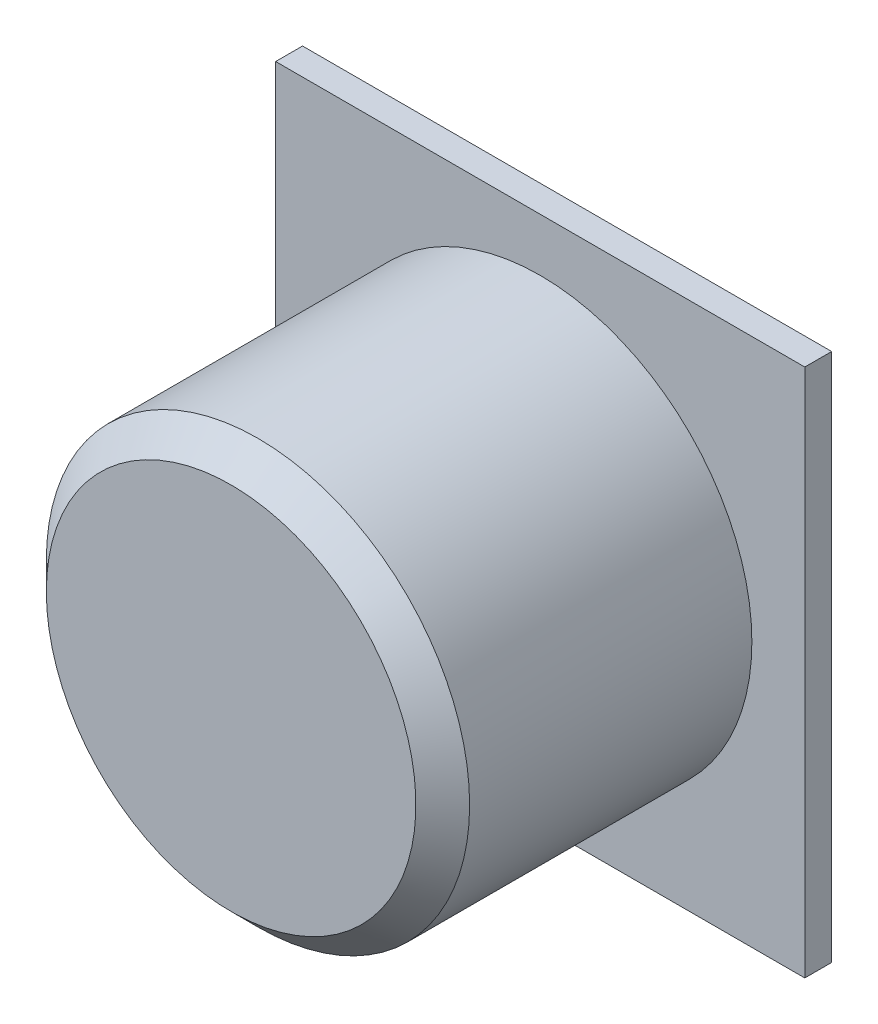
ISO-10303-21;
HEADER;
FILE_DESCRIPTION(('STEP AP214'),'2;1');
FILE_NAME('part.step','',(''),(''),'','','');
FILE_SCHEMA(('AUTOMOTIVE_DESIGN { 1 0 10303 214 1 1 1 1 }'));
ENDSEC;
DATA;
#1=APPLICATION_CONTEXT('core data for automotive mechanical design processes');
#2=APPLICATION_PROTOCOL_DEFINITION('international standard','automotive_design',2000,#1);
#3=PRODUCT_CONTEXT('',#1,'mechanical');
#4=PRODUCT('Part','Part','',(#3));
#5=PRODUCT_RELATED_PRODUCT_CATEGORY('part','',(#4));
#6=PRODUCT_DEFINITION_FORMATION('','',#4);
#7=PRODUCT_DEFINITION_CONTEXT('part definition',#1,'design');
#8=PRODUCT_DEFINITION('design','',#6,#7);
#9=PRODUCT_DEFINITION_SHAPE('','',#8);
#10=(LENGTH_UNIT() NAMED_UNIT(*) SI_UNIT(.MILLI.,.METRE.));
#11=(NAMED_UNIT(*) PLANE_ANGLE_UNIT() SI_UNIT($,.RADIAN.));
#12=(NAMED_UNIT(*) SI_UNIT($,.STERADIAN.) SOLID_ANGLE_UNIT());
#13=UNCERTAINTY_MEASURE_WITH_UNIT(LENGTH_MEASURE(1.E-05),#10,'distance_accuracy_value','');
#14=(GEOMETRIC_REPRESENTATION_CONTEXT(3) GLOBAL_UNCERTAINTY_ASSIGNED_CONTEXT((#13)) GLOBAL_UNIT_ASSIGNED_CONTEXT((#10,
#11,#12)) REPRESENTATION_CONTEXT('',''));
#15=CARTESIAN_POINT('',(0.,0.,0.));
#16=DIRECTION('',(0.,0.,1.));
#17=DIRECTION('',(1.,0.,0.));
#18=AXIS2_PLACEMENT_3D('',#15,#16,#17);
#19=CARTESIAN_POINT('',(-50.,-50.,5.08));
#20=DIRECTION('',(1.,0.,0.));
#21=DIRECTION('',(0.,0.,-1.));
#22=AXIS2_PLACEMENT_3D('',#19,#20,#21);
#23=PLANE('',#22);
#24=DIRECTION('',(0.,-1.,0.));
#25=VECTOR('',#24,1.);
#26=CARTESIAN_POINT('',(-50.,-50.,0.));
#27=LINE('',#26,#25);
#28=CARTESIAN_POINT('',(-50.,50.,0.));
#29=VERTEX_POINT('',#28);
#30=CARTESIAN_POINT('',(-50.,-50.,0.));
#31=VERTEX_POINT('',#30);
#32=EDGE_CURVE('E112',#29,#31,#27,.T.);
#33=ORIENTED_EDGE('',*,*,#32,.T.);
#34=DIRECTION('',(0.,0.,-1.));
#35=VECTOR('',#34,1.);
#36=CARTESIAN_POINT('',(-50.,-50.,5.08));
#37=LINE('',#36,#35);
#38=CARTESIAN_POINT('',(-50.,-50.,5.08));
#39=VERTEX_POINT('',#38);
#40=EDGE_CURVE('E101',#39,#31,#37,.T.);
#41=ORIENTED_EDGE('',*,*,#40,.F.);
#42=DIRECTION('',(0.,-1.,0.));
#43=VECTOR('',#42,1.);
#44=CARTESIAN_POINT('',(-50.,-50.,5.08));
#45=LINE('',#44,#43);
#46=CARTESIAN_POINT('',(-50.,50.,5.08));
#47=VERTEX_POINT('',#46);
#48=EDGE_CURVE('E93',#47,#39,#45,.T.);
#49=ORIENTED_EDGE('',*,*,#48,.F.);
#50=DIRECTION('',(0.,0.,-1.));
#51=VECTOR('',#50,1.);
#52=CARTESIAN_POINT('',(-50.,50.,5.08));
#53=LINE('',#52,#51);
#54=EDGE_CURVE('E108',#47,#29,#53,.T.);
#55=ORIENTED_EDGE('',*,*,#54,.T.);
#56=EDGE_LOOP('',(#33,#41,#49,#55));
#57=FACE_BOUND('',#56,.T.);
#58=ADVANCED_FACE('F39',(#57),#23,.F.);
#59=CARTESIAN_POINT('',(50.,-50.,5.08));
#60=DIRECTION('',(0.,1.,0.));
#61=DIRECTION('',(-1.,0.,0.));
#62=AXIS2_PLACEMENT_3D('',#59,#60,#61);
#63=PLANE('',#62);
#64=DIRECTION('',(1.,0.,0.));
#65=VECTOR('',#64,1.);
#66=CARTESIAN_POINT('',(50.,-50.,0.));
#67=LINE('',#66,#65);
#68=CARTESIAN_POINT('',(50.,-50.,0.));
#69=VERTEX_POINT('',#68);
#70=EDGE_CURVE('E99',#31,#69,#67,.T.);
#71=ORIENTED_EDGE('',*,*,#70,.T.);
#72=DIRECTION('',(0.,0.,-1.));
#73=VECTOR('',#72,1.);
#74=CARTESIAN_POINT('',(50.,-50.,5.08));
#75=LINE('',#74,#73);
#76=CARTESIAN_POINT('',(50.,-50.,5.08));
#77=VERTEX_POINT('',#76);
#78=EDGE_CURVE('E97',#77,#69,#75,.T.);
#79=ORIENTED_EDGE('',*,*,#78,.F.);
#80=DIRECTION('',(1.,0.,0.));
#81=VECTOR('',#80,1.);
#82=CARTESIAN_POINT('',(50.,-50.,5.08));
#83=LINE('',#82,#81);
#84=EDGE_CURVE('E88',#39,#77,#83,.T.);
#85=ORIENTED_EDGE('',*,*,#84,.F.);
#86=ORIENTED_EDGE('',*,*,#40,.T.);
#87=EDGE_LOOP('',(#71,#79,#85,#86));
#88=FACE_BOUND('',#87,.T.);
#89=ADVANCED_FACE('F98',(#88),#63,.F.);
#90=CARTESIAN_POINT('',(50.,-50.,5.08));
#91=DIRECTION('',(-1.,0.,0.));
#92=DIRECTION('',(0.,-1.,0.));
#93=AXIS2_PLACEMENT_3D('',#90,#91,#92);
#94=PLANE('',#93);
#95=DIRECTION('',(0.,1.,0.));
#96=VECTOR('',#95,1.);
#97=CARTESIAN_POINT('',(50.,-50.,0.));
#98=LINE('',#97,#96);
#99=CARTESIAN_POINT('',(50.,50.,0.));
#100=VERTEX_POINT('',#99);
#101=EDGE_CURVE('E74',#69,#100,#98,.T.);
#102=ORIENTED_EDGE('',*,*,#101,.T.);
#103=DIRECTION('',(0.,0.,-1.));
#104=VECTOR('',#103,1.);
#105=CARTESIAN_POINT('',(50.,50.,5.08));
#106=LINE('',#105,#104);
#107=CARTESIAN_POINT('',(50.,50.,5.08));
#108=VERTEX_POINT('',#107);
#109=EDGE_CURVE('E102',#108,#100,#106,.T.);
#110=ORIENTED_EDGE('',*,*,#109,.F.);
#111=DIRECTION('',(0.,1.,0.));
#112=VECTOR('',#111,1.);
#113=CARTESIAN_POINT('',(50.,-50.,5.08));
#114=LINE('',#113,#112);
#115=EDGE_CURVE('E91',#77,#108,#114,.T.);
#116=ORIENTED_EDGE('',*,*,#115,.F.);
#117=ORIENTED_EDGE('',*,*,#78,.T.);
#118=EDGE_LOOP('',(#102,#110,#116,#117));
#119=FACE_BOUND('',#118,.T.);
#120=ADVANCED_FACE('F104',(#119),#94,.F.);
#121=CARTESIAN_POINT('',(50.,50.,5.08));
#122=DIRECTION('',(0.,-1.,0.));
#123=DIRECTION('',(1.,0.,0.));
#124=AXIS2_PLACEMENT_3D('',#121,#122,#123);
#125=PLANE('',#124);
#126=DIRECTION('',(-1.,0.,0.));
#127=VECTOR('',#126,1.);
#128=CARTESIAN_POINT('',(50.,50.,0.));
#129=LINE('',#128,#127);
#130=EDGE_CURVE('E80',#100,#29,#129,.T.);
#131=ORIENTED_EDGE('',*,*,#130,.T.);
#132=ORIENTED_EDGE('',*,*,#54,.F.);
#133=DIRECTION('',(-1.,0.,0.));
#134=VECTOR('',#133,1.);
#135=CARTESIAN_POINT('',(50.,50.,5.08));
#136=LINE('',#135,#134);
#137=EDGE_CURVE('E57',#108,#47,#136,.T.);
#138=ORIENTED_EDGE('',*,*,#137,.F.);
#139=ORIENTED_EDGE('',*,*,#109,.T.);
#140=EDGE_LOOP('',(#131,#132,#138,#139));
#141=FACE_BOUND('',#140,.T.);
#142=ADVANCED_FACE('F151',(#141),#125,.F.);
#143=CARTESIAN_POINT('',(0.,0.,5.08));
#144=DIRECTION('',(0.,0.,1.));
#145=DIRECTION('',(1.,0.,0.));
#146=AXIS2_PLACEMENT_3D('',#143,#144,#145);
#147=PLANE('',#146);
#148=CARTESIAN_POINT('',(0.,0.,5.08));
#149=DIRECTION('',(0.,0.,1.));
#150=DIRECTION('',(1.,0.,0.));
#151=AXIS2_PLACEMENT_3D('',#148,#149,#150);
#152=CIRCLE('',#151,40.);
#153=CARTESIAN_POINT('',(40.,0.,5.08));
#154=VERTEX_POINT('',#153);
#155=EDGE_CURVE('E116',#154,#154,#152,.F.);
#156=ORIENTED_EDGE('',*,*,#155,.T.);
#157=EDGE_LOOP('',(#156));
#158=FACE_BOUND('',#157,.T.);
#159=ORIENTED_EDGE('',*,*,#48,.T.);
#160=ORIENTED_EDGE('',*,*,#84,.T.);
#161=ORIENTED_EDGE('',*,*,#115,.T.);
#162=ORIENTED_EDGE('',*,*,#137,.T.);
#163=EDGE_LOOP('',(#159,#160,#161,#162));
#164=FACE_BOUND('',#163,.T.);
#165=ADVANCED_FACE('F89',(#158,#164),#147,.T.);
#166=CARTESIAN_POINT('',(0.,0.,0.));
#167=DIRECTION('',(0.,0.,1.));
#168=DIRECTION('',(1.,0.,0.));
#169=AXIS2_PLACEMENT_3D('',#166,#167,#168);
#170=PLANE('',#169);
#171=ORIENTED_EDGE('',*,*,#32,.F.);
#172=ORIENTED_EDGE('',*,*,#130,.F.);
#173=ORIENTED_EDGE('',*,*,#101,.F.);
#174=ORIENTED_EDGE('',*,*,#70,.F.);
#175=EDGE_LOOP('',(#171,#172,#173,#174));
#176=FACE_BOUND('',#175,.T.);
#177=ADVANCED_FACE('F154',(#176),#170,.F.);
#178=CARTESIAN_POINT('',(0.,0.,63.5));
#179=DIRECTION('',(0.,0.,-1.));
#180=DIRECTION('',(-1.,0.,0.));
#181=AXIS2_PLACEMENT_3D('',#178,#179,#180);
#182=CYLINDRICAL_SURFACE('',#181,40.);
#183=CARTESIAN_POINT('',(0.,0.,58.42));
#184=DIRECTION('',(0.,0.,1.));
#185=DIRECTION('',(1.,0.,0.));
#186=AXIS2_PLACEMENT_3D('',#183,#184,#185);
#187=CIRCLE('',#186,40.);
#188=CARTESIAN_POINT('',(-40.,0.,58.42));
#189=VERTEX_POINT('',#188);
#190=EDGE_CURVE('E11',#189,#189,#187,.F.);
#191=ORIENTED_EDGE('',*,*,#190,.T.);
#192=EDGE_LOOP('',(#191));
#193=FACE_BOUND('',#192,.T.);
#194=ORIENTED_EDGE('',*,*,#155,.F.);
#195=EDGE_LOOP('',(#194));
#196=FACE_BOUND('',#195,.T.);
#197=ADVANCED_FACE('F139',(#193,#196),#182,.T.);
#198=CARTESIAN_POINT('',(0.,0.,63.5));
#199=DIRECTION('',(0.,0.,1.));
#200=DIRECTION('',(1.,0.,0.));
#201=AXIS2_PLACEMENT_3D('',#198,#199,#200);
#202=PLANE('',#201);
#203=CARTESIAN_POINT('',(0.,0.,63.5));
#204=DIRECTION('',(0.,0.,1.));
#205=DIRECTION('',(1.,0.,0.));
#206=AXIS2_PLACEMENT_3D('',#203,#204,#205);
#207=CIRCLE('',#206,34.92);
#208=CARTESIAN_POINT('',(-34.92,0.,63.5));
#209=VERTEX_POINT('',#208);
#210=EDGE_CURVE('E49',#209,#209,#207,.T.);
#211=ORIENTED_EDGE('',*,*,#210,.T.);
#212=EDGE_LOOP('',(#211));
#213=FACE_BOUND('',#212,.T.);
#214=ADVANCED_FACE('F132',(#213),#202,.T.);
#215=CARTESIAN_POINT('',(0.,0.,63.5));
#216=DIRECTION('',(0.,0.,-1.));
#217=DIRECTION('',(-1.,0.,0.));
#218=AXIS2_PLACEMENT_3D('',#215,#216,#217);
#219=CONICAL_SURFACE('',#218,34.92,0.785398163397445);
#220=CARTESIAN_POINT('',(-40.,0.,58.42));
#221=CARTESIAN_POINT('',(-39.9470833333333,0.,58.4729166666666));
#222=CARTESIAN_POINT('',(-39.8941666666667,0.,58.5258333333333));
#223=CARTESIAN_POINT('',(-39.7883333333333,0.,58.6316666666666));
#224=CARTESIAN_POINT('',(-39.7354166666667,0.,58.6845833333333));
#225=CARTESIAN_POINT('',(-39.6295833333333,0.,58.7904166666666));
#226=CARTESIAN_POINT('',(-39.5766666666667,0.,58.8433333333333));
#227=CARTESIAN_POINT('',(-39.4708333333333,0.,58.9491666666666));
#228=CARTESIAN_POINT('',(-39.4179166666667,0.,59.0020833333333));
#229=CARTESIAN_POINT('',(-39.3120833333333,0.,59.1079166666666));
#230=CARTESIAN_POINT('',(-39.2591666666667,0.,59.1608333333333));
#231=CARTESIAN_POINT('',(-39.1533333333333,0.,59.2666666666666));
#232=CARTESIAN_POINT('',(-39.1004166666667,0.,59.3195833333333));
#233=CARTESIAN_POINT('',(-38.9945833333333,0.,59.4254166666666));
#234=CARTESIAN_POINT('',(-38.9416666666667,0.,59.4783333333333));
#235=CARTESIAN_POINT('',(-38.8358333333333,0.,59.5841666666666));
#236=CARTESIAN_POINT('',(-38.7829166666667,0.,59.6370833333333));
#237=CARTESIAN_POINT('',(-38.6770833333333,0.,59.7429166666666));
#238=CARTESIAN_POINT('',(-38.6241666666667,0.,59.7958333333333));
#239=CARTESIAN_POINT('',(-38.5183333333333,0.,59.9016666666666));
#240=CARTESIAN_POINT('',(-38.4654166666667,0.,59.9545833333333));
#241=CARTESIAN_POINT('',(-38.3595833333333,0.,60.0604166666666));
#242=CARTESIAN_POINT('',(-38.3066666666667,0.,60.1133333333333));
#243=CARTESIAN_POINT('',(-38.2008333333333,0.,60.2191666666666));
#244=CARTESIAN_POINT('',(-38.1479166666667,0.,60.2720833333333));
#245=CARTESIAN_POINT('',(-38.0420833333333,0.,60.3779166666666));
#246=CARTESIAN_POINT('',(-37.9891666666667,0.,60.4308333333333));
#247=CARTESIAN_POINT('',(-37.8833333333333,0.,60.5366666666666));
#248=CARTESIAN_POINT('',(-37.8304166666667,0.,60.5895833333333));
#249=CARTESIAN_POINT('',(-37.7245833333333,0.,60.6954166666666));
#250=CARTESIAN_POINT('',(-37.6716666666667,0.,60.7483333333333));
#251=CARTESIAN_POINT('',(-37.5658333333333,0.,60.8541666666666));
#252=CARTESIAN_POINT('',(-37.5129166666667,0.,60.9070833333333));
#253=CARTESIAN_POINT('',(-37.4070833333333,0.,61.0129166666666));
#254=CARTESIAN_POINT('',(-37.3541666666667,0.,61.0658333333333));
#255=CARTESIAN_POINT('',(-37.2483333333333,0.,61.1716666666666));
#256=CARTESIAN_POINT('',(-37.1954166666667,0.,61.2245833333333));
#257=CARTESIAN_POINT('',(-37.0895833333333,0.,61.3304166666666));
#258=CARTESIAN_POINT('',(-37.0366666666667,0.,61.3833333333333));
#259=CARTESIAN_POINT('',(-36.9308333333333,0.,61.4891666666666));
#260=CARTESIAN_POINT('',(-36.8779166666667,0.,61.5420833333333));
#261=CARTESIAN_POINT('',(-36.7720833333333,0.,61.6479166666666));
#262=CARTESIAN_POINT('',(-36.7191666666667,0.,61.7008333333333));
#263=CARTESIAN_POINT('',(-36.6133333333333,0.,61.8066666666667));
#264=CARTESIAN_POINT('',(-36.5604166666667,0.,61.8595833333333));
#265=CARTESIAN_POINT('',(-36.4545833333333,0.,61.9654166666666));
#266=CARTESIAN_POINT('',(-36.4016666666667,0.,62.0183333333333));
#267=CARTESIAN_POINT('',(-36.2958333333333,0.,62.1241666666666));
#268=CARTESIAN_POINT('',(-36.2429166666667,0.,62.1770833333333));
#269=CARTESIAN_POINT('',(-36.1370833333333,0.,62.2829166666667));
#270=CARTESIAN_POINT('',(-36.0841666666667,0.,62.3358333333333));
#271=CARTESIAN_POINT('',(-35.9783333333333,0.,62.4416666666667));
#272=CARTESIAN_POINT('',(-35.9254166666667,0.,62.4945833333333));
#273=CARTESIAN_POINT('',(-35.8195833333333,0.,62.6004166666667));
#274=CARTESIAN_POINT('',(-35.7666666666667,0.,62.6533333333333));
#275=CARTESIAN_POINT('',(-35.6608333333333,0.,62.7591666666667));
#276=CARTESIAN_POINT('',(-35.6079166666667,0.,62.8120833333333));
#277=CARTESIAN_POINT('',(-35.5020833333333,0.,62.9179166666667));
#278=CARTESIAN_POINT('',(-35.4491666666667,0.,62.9708333333333));
#279=CARTESIAN_POINT('',(-35.3433333333333,0.,63.0766666666667));
#280=CARTESIAN_POINT('',(-35.2904166666667,0.,63.1295833333333));
#281=CARTESIAN_POINT('',(-35.1845833333333,0.,63.2354166666667));
#282=CARTESIAN_POINT('',(-35.1316666666667,0.,63.2883333333333));
#283=CARTESIAN_POINT('',(-35.0258333333333,0.,63.3941666666667));
#284=CARTESIAN_POINT('',(-34.9729166666667,0.,63.4470833333333));
#285=CARTESIAN_POINT('',(-34.92,0.,63.5));
#286=B_SPLINE_CURVE_WITH_KNOTS('',3,(#220,#221,#222,#223,#224,#225,#226,#227,#228,#229,#230,
#231,#232,#233,#234,#235,#236,#237,#238,#239,#240,#241,#242,#243,#244,#245,#246,#247,#248,#249,
#250,#251,#252,#253,#254,#255,#256,#257,#258,#259,#260,#261,#262,#263,#264,#265,#266,#267,#268,
#269,#270,#271,#272,#273,#274,#275,#276,#277,#278,#279,#280,#281,#282,#283,#284,#285),
.UNSPECIFIED.,.F.,.F.,(4,2,2,2,2,2,2,2,2,2,2,2,2,2,2,2,2,2,2,2,2,2,2,2,2,2,2,2,2,2,2,2,4),(0.,
0.224506403026733,0.44901280605346,0.673519209080193,0.898025612106925,1.12253201513365,
1.34703841816038,1.57154482118711,1.79605122421384,2.02055762724057,2.2450640302673,
2.46957043329403,2.69407683632076,2.91858323934749,3.14308964237422,3.36759604540095,
3.59210244842768,3.81660885145441,4.04111525448114,4.26562165750787,4.4901280605346,
4.71463446356133,4.93914086658806,5.16364726961479,5.38815367264152,5.61266007566825,
5.83716647869498,6.06167288172171,6.28617928474844,6.51068568777517,6.7351920908019,
6.95969849382863,7.18420489685536),.UNSPECIFIED.);
#287=EDGE_CURVE('BSEAM41',#189,#209,#286,.T.);
#288=ORIENTED_EDGE('',*,*,#190,.F.);
#289=ORIENTED_EDGE('',*,*,#210,.F.);
#290=ORIENTED_EDGE('',*,*,#287,.T.);
#291=ORIENTED_EDGE('',*,*,#287,.F.);
#292=EDGE_LOOP('',(#288,#290,#289,#291));
#293=FACE_BOUND('',#292,.T.);
#294=ADVANCED_FACE('F41',(#293),#219,.T.);
#295=CLOSED_SHELL('',(#58,#89,#120,#142,#165,#177,#197,#214,#294));
#296=MANIFOLD_SOLID_BREP('B2',#295);
#297=ADVANCED_BREP_SHAPE_REPRESENTATION('',(#18,#296),#14);
#298=SHAPE_DEFINITION_REPRESENTATION(#9,#297);
ENDSEC;
END-ISO-10303-21;
